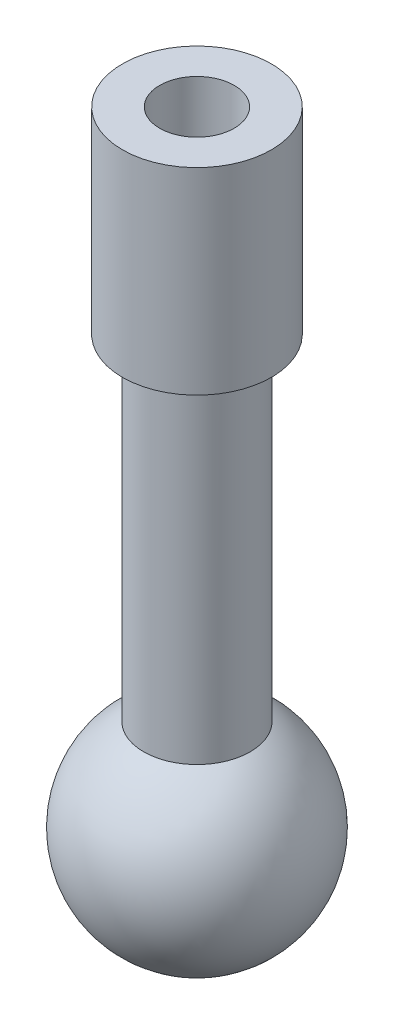
ISO-10303-21;
HEADER;
FILE_DESCRIPTION(('STEP AP214'),'2;1');
FILE_NAME('part.step','',(''),(''),'','','');
FILE_SCHEMA(('AUTOMOTIVE_DESIGN { 1 0 10303 214 1 1 1 1 }'));
ENDSEC;
DATA;
#1=APPLICATION_CONTEXT('core data for automotive mechanical design processes');
#2=APPLICATION_PROTOCOL_DEFINITION('international standard','automotive_design',2000,#1);
#3=PRODUCT_CONTEXT('',#1,'mechanical');
#4=PRODUCT('Part','Part','',(#3));
#5=PRODUCT_RELATED_PRODUCT_CATEGORY('part','',(#4));
#6=PRODUCT_DEFINITION_FORMATION('','',#4);
#7=PRODUCT_DEFINITION_CONTEXT('part definition',#1,'design');
#8=PRODUCT_DEFINITION('design','',#6,#7);
#9=PRODUCT_DEFINITION_SHAPE('','',#8);
#10=(LENGTH_UNIT() NAMED_UNIT(*) SI_UNIT(.MILLI.,.METRE.));
#11=(NAMED_UNIT(*) PLANE_ANGLE_UNIT() SI_UNIT($,.RADIAN.));
#12=(NAMED_UNIT(*) SI_UNIT($,.STERADIAN.) SOLID_ANGLE_UNIT());
#13=UNCERTAINTY_MEASURE_WITH_UNIT(LENGTH_MEASURE(1.E-05),#10,'distance_accuracy_value','');
#14=(GEOMETRIC_REPRESENTATION_CONTEXT(3) GLOBAL_UNCERTAINTY_ASSIGNED_CONTEXT((#13)) GLOBAL_UNIT_ASSIGNED_CONTEXT((#10,
#11,#12)) REPRESENTATION_CONTEXT('',''));
#15=CARTESIAN_POINT('',(0.,0.,0.));
#16=DIRECTION('',(0.,0.,1.));
#17=DIRECTION('',(1.,0.,0.));
#18=AXIS2_PLACEMENT_3D('',#15,#16,#17);
#19=CARTESIAN_POINT('',(0.,41.734293269582,0.));
#20=DIRECTION('',(0.,1.,0.));
#21=DIRECTION('',(-1.,0.,0.));
#22=AXIS2_PLACEMENT_3D('',#19,#20,#21);
#23=CYLINDRICAL_SURFACE('',#22,5.);
#24=CARTESIAN_POINT('',(0.,-8.26570673041799,0.));
#25=DIRECTION('',(0.,1.,0.));
#26=DIRECTION('',(-1.,0.,0.));
#27=AXIS2_PLACEMENT_3D('',#24,#25,#26);
#28=CIRCLE('',#27,5.);
#29=CARTESIAN_POINT('',(-4.99999999999999,-8.26570673041799,0.));
#30=VERTEX_POINT('',#29);
#31=EDGE_CURVE('E51',#30,#30,#28,.T.);
#32=ORIENTED_EDGE('',*,*,#31,.T.);
#33=EDGE_LOOP('',(#32));
#34=FACE_BOUND('',#33,.T.);
#35=CARTESIAN_POINT('',(0.,23.2139810571155,0.));
#36=DIRECTION('',(0.,1.,0.));
#37=DIRECTION('',(0.,0.,1.));
#38=AXIS2_PLACEMENT_3D('',#35,#36,#37);
#39=CIRCLE('',#38,5.);
#40=CARTESIAN_POINT('',(0.,23.2139810571155,5.));
#41=VERTEX_POINT('',#40);
#42=EDGE_CURVE('E10',#41,#41,#39,.T.);
#43=ORIENTED_EDGE('',*,*,#42,.F.);
#44=EDGE_LOOP('',(#43));
#45=FACE_BOUND('',#44,.T.);
#46=ADVANCED_FACE('F43',(#34,#45),#23,.T.);
#47=CARTESIAN_POINT('',(0.,-16.9259607682624,0.));
#48=DIRECTION('',(0.,1.,0.));
#49=DIRECTION('',(1.,0.,0.));
#50=AXIS2_PLACEMENT_3D('',#47,#48,#49);
#51=SPHERICAL_SURFACE('',#50,10.);
#52=ORIENTED_EDGE('',*,*,#31,.F.);
#53=EDGE_LOOP('',(#52));
#54=FACE_BOUND('',#53,.T.);
#55=ADVANCED_FACE('F96',(#54),#51,.T.);
#56=CARTESIAN_POINT('',(0.,23.2139810571155,0.));
#57=DIRECTION('',(0.,1.,0.));
#58=DIRECTION('',(0.,0.,1.));
#59=AXIS2_PLACEMENT_3D('',#56,#57,#58);
#60=PLANE('',#59);
#61=ORIENTED_EDGE('',*,*,#42,.T.);
#62=EDGE_LOOP('',(#61));
#63=FACE_BOUND('',#62,.T.);
#64=CARTESIAN_POINT('',(0.,23.2139810571155,0.));
#65=DIRECTION('',(0.,1.,0.));
#66=DIRECTION('',(0.,0.,1.));
#67=AXIS2_PLACEMENT_3D('',#64,#65,#66);
#68=CIRCLE('',#67,7.);
#69=CARTESIAN_POINT('',(0.,23.2139810571155,7.));
#70=VERTEX_POINT('',#69);
#71=EDGE_CURVE('E56',#70,#70,#68,.T.);
#72=ORIENTED_EDGE('',*,*,#71,.F.);
#73=EDGE_LOOP('',(#72));
#74=FACE_BOUND('',#73,.T.);
#75=ADVANCED_FACE('F91',(#63,#74),#60,.F.);
#76=CARTESIAN_POINT('',(0.,41.734293269582,0.));
#77=DIRECTION('',(0.,1.,0.));
#78=DIRECTION('',(0.,0.,1.));
#79=AXIS2_PLACEMENT_3D('',#76,#77,#78);
#80=CYLINDRICAL_SURFACE('',#79,7.);
#81=CARTESIAN_POINT('',(0.,41.734293269582,0.));
#82=DIRECTION('',(0.,1.,0.));
#83=DIRECTION('',(0.,0.,1.));
#84=AXIS2_PLACEMENT_3D('',#81,#82,#83);
#85=CIRCLE('',#84,7.);
#86=CARTESIAN_POINT('',(0.,41.734293269582,7.));
#87=VERTEX_POINT('',#86);
#88=EDGE_CURVE('E61',#87,#87,#85,.T.);
#89=ORIENTED_EDGE('',*,*,#88,.F.);
#90=EDGE_LOOP('',(#89));
#91=FACE_BOUND('',#90,.T.);
#92=ORIENTED_EDGE('',*,*,#71,.T.);
#93=EDGE_LOOP('',(#92));
#94=FACE_BOUND('',#93,.T.);
#95=ADVANCED_FACE('F86',(#91,#94),#80,.T.);
#96=CARTESIAN_POINT('',(0.,41.734293269582,0.));
#97=DIRECTION('',(0.,-1.,0.));
#98=DIRECTION('',(1.,0.,0.));
#99=AXIS2_PLACEMENT_3D('',#96,#97,#98);
#100=PLANE('',#99);
#101=CARTESIAN_POINT('',(0.,41.734293269582,0.));
#102=DIRECTION('',(0.,1.,0.));
#103=DIRECTION('',(-1.,0.,0.));
#104=AXIS2_PLACEMENT_3D('',#101,#102,#103);
#105=CIRCLE('',#104,3.5);
#106=CARTESIAN_POINT('',(-3.50000000000001,41.734293269582,0.));
#107=VERTEX_POINT('',#106);
#108=EDGE_CURVE('E68',#107,#107,#105,.T.);
#109=ORIENTED_EDGE('',*,*,#108,.F.);
#110=EDGE_LOOP('',(#109));
#111=FACE_BOUND('',#110,.T.);
#112=ORIENTED_EDGE('',*,*,#88,.T.);
#113=EDGE_LOOP('',(#112));
#114=FACE_BOUND('',#113,.T.);
#115=ADVANCED_FACE('F45',(#111,#114),#100,.F.);
#116=CARTESIAN_POINT('',(0.,36.734293269582,0.));
#117=DIRECTION('',(0.,1.,0.));
#118=DIRECTION('',(-1.,0.,0.));
#119=AXIS2_PLACEMENT_3D('',#116,#117,#118);
#120=CYLINDRICAL_SURFACE('',#119,3.5);
#121=CARTESIAN_POINT('',(0.,36.734293269582,0.));
#122=DIRECTION('',(0.,1.,0.));
#123=DIRECTION('',(-1.,0.,0.));
#124=AXIS2_PLACEMENT_3D('',#121,#122,#123);
#125=CIRCLE('',#124,3.5);
#126=CARTESIAN_POINT('',(-3.5,36.734293269582,0.));
#127=VERTEX_POINT('',#126);
#128=EDGE_CURVE('E67',#127,#127,#125,.T.);
#129=ORIENTED_EDGE('',*,*,#128,.F.);
#130=EDGE_LOOP('',(#129));
#131=FACE_BOUND('',#130,.T.);
#132=ORIENTED_EDGE('',*,*,#108,.T.);
#133=EDGE_LOOP('',(#132));
#134=FACE_BOUND('',#133,.T.);
#135=ADVANCED_FACE('F78',(#131,#134),#120,.F.);
#136=CARTESIAN_POINT('',(0.,36.734293269582,0.));
#137=DIRECTION('',(0.,1.,0.));
#138=DIRECTION('',(-1.,0.,0.));
#139=AXIS2_PLACEMENT_3D('',#136,#137,#138);
#140=PLANE('',#139);
#141=ORIENTED_EDGE('',*,*,#128,.T.);
#142=EDGE_LOOP('',(#141));
#143=FACE_BOUND('',#142,.T.);
#144=ADVANCED_FACE('F76',(#143),#140,.T.);
#145=CLOSED_SHELL('',(#46,#55,#75,#95,#115,#135,#144));
#146=MANIFOLD_SOLID_BREP('B2',#145);
#147=ADVANCED_BREP_SHAPE_REPRESENTATION('',(#18,#146),#14);
#148=SHAPE_DEFINITION_REPRESENTATION(#9,#147);
ENDSEC;
END-ISO-10303-21;
